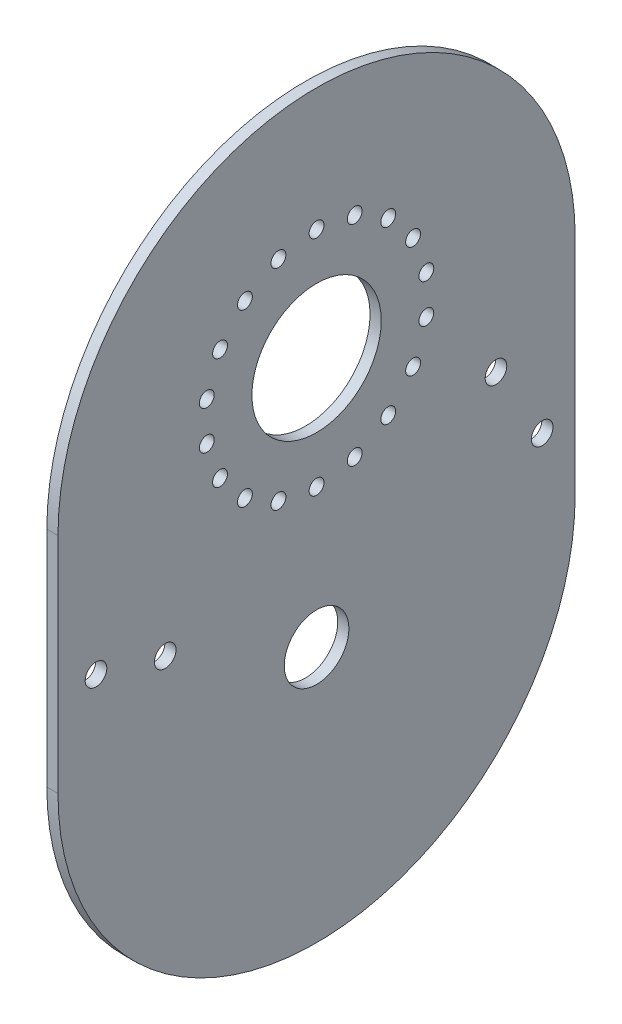
ISO-10303-21;
HEADER;
FILE_DESCRIPTION(('STEP AP214'),'2;1');
FILE_NAME('part.step','',(''),(''),'','','');
FILE_SCHEMA(('AUTOMOTIVE_DESIGN { 1 0 10303 214 1 1 1 1 }'));
ENDSEC;
DATA;
#1=APPLICATION_CONTEXT('core data for automotive mechanical design processes');
#2=APPLICATION_PROTOCOL_DEFINITION('international standard','automotive_design',2000,#1);
#3=PRODUCT_CONTEXT('',#1,'mechanical');
#4=PRODUCT('Part','Part','',(#3));
#5=PRODUCT_RELATED_PRODUCT_CATEGORY('part','',(#4));
#6=PRODUCT_DEFINITION_FORMATION('','',#4);
#7=PRODUCT_DEFINITION_CONTEXT('part definition',#1,'design');
#8=PRODUCT_DEFINITION('design','',#6,#7);
#9=PRODUCT_DEFINITION_SHAPE('','',#8);
#10=(LENGTH_UNIT() NAMED_UNIT(*) SI_UNIT(.MILLI.,.METRE.));
#11=(NAMED_UNIT(*) PLANE_ANGLE_UNIT() SI_UNIT($,.RADIAN.));
#12=(NAMED_UNIT(*) SI_UNIT($,.STERADIAN.) SOLID_ANGLE_UNIT());
#13=UNCERTAINTY_MEASURE_WITH_UNIT(LENGTH_MEASURE(1.E-05),#10,'distance_accuracy_value','');
#14=(GEOMETRIC_REPRESENTATION_CONTEXT(3) GLOBAL_UNCERTAINTY_ASSIGNED_CONTEXT((#13)) GLOBAL_UNIT_ASSIGNED_CONTEXT((#10,
#11,#12)) REPRESENTATION_CONTEXT('',''));
#15=CARTESIAN_POINT('',(0.,0.,0.));
#16=DIRECTION('',(0.,0.,1.));
#17=DIRECTION('',(1.,0.,0.));
#18=AXIS2_PLACEMENT_3D('',#15,#16,#17);
#19=CARTESIAN_POINT('',(6.25,1.0079783854671,173.991145722186));
#20=DIRECTION('',(0.,0.,-1.));
#21=DIRECTION('',(-1.,0.,0.));
#22=AXIS2_PLACEMENT_3D('',#19,#20,#21);
#23=PLANE('',#22);
#24=DIRECTION('',(0.,-1.,0.));
#25=VECTOR('',#24,1.);
#26=CARTESIAN_POINT('',(-1.25,1.0079783854671,173.991145722186));
#27=LINE('',#26,#25);
#28=CARTESIAN_POINT('',(-1.25,76.1579783854671,173.991145722186));
#29=VERTEX_POINT('',#28);
#30=CARTESIAN_POINT('',(-1.25,-74.1420216145329,173.991145722186));
#31=VERTEX_POINT('',#30);
#32=EDGE_CURVE('E121',#29,#31,#27,.T.);
#33=ORIENTED_EDGE('',*,*,#32,.T.);
#34=DIRECTION('',(-1.,0.,0.));
#35=VECTOR('',#34,1.);
#36=CARTESIAN_POINT('',(6.25,-74.1420216145329,173.991145722186));
#37=LINE('',#36,#35);
#38=CARTESIAN_POINT('',(6.25,-74.1420216145329,173.991145722186));
#39=VERTEX_POINT('',#38);
#40=EDGE_CURVE('E11',#39,#31,#37,.T.);
#41=ORIENTED_EDGE('',*,*,#40,.F.);
#42=DIRECTION('',(0.,-1.,0.));
#43=VECTOR('',#42,1.);
#44=CARTESIAN_POINT('',(6.25,1.0079783854671,173.991145722186));
#45=LINE('',#44,#43);
#46=CARTESIAN_POINT('',(6.25,76.1579783854671,173.991145722186));
#47=VERTEX_POINT('',#46);
#48=EDGE_CURVE('E87',#47,#39,#45,.T.);
#49=ORIENTED_EDGE('',*,*,#48,.F.);
#50=DIRECTION('',(-1.,0.,0.));
#51=VECTOR('',#50,1.);
#52=CARTESIAN_POINT('',(6.25,76.1579783854671,173.991145722186));
#53=LINE('',#52,#51);
#54=EDGE_CURVE('E99',#47,#29,#53,.T.);
#55=ORIENTED_EDGE('',*,*,#54,.T.);
#56=EDGE_LOOP('',(#33,#41,#49,#55));
#57=FACE_BOUND('',#56,.T.);
#58=ADVANCED_FACE('F37',(#57),#23,.F.);
#59=CARTESIAN_POINT('',(6.25,-74.1420216145329,-0.00885427781406736));
#60=DIRECTION('',(-1.,0.,0.));
#61=DIRECTION('',(0.,0.,1.));
#62=AXIS2_PLACEMENT_3D('',#59,#60,#61);
#63=CYLINDRICAL_SURFACE('',#62,174.);
#64=CARTESIAN_POINT('',(-1.25,-74.1420216145329,-0.00885427781406736));
#65=DIRECTION('',(1.,0.,0.));
#66=DIRECTION('',(0.,0.,-1.));
#67=AXIS2_PLACEMENT_3D('',#64,#65,#66);
#68=CIRCLE('',#67,174.);
#69=CARTESIAN_POINT('',(-1.25,-74.1420216145329,-174.008854277814));
#70=VERTEX_POINT('',#69);
#71=EDGE_CURVE('E92',#31,#70,#68,.T.);
#72=ORIENTED_EDGE('',*,*,#71,.T.);
#73=DIRECTION('',(-1.,0.,0.));
#74=VECTOR('',#73,1.);
#75=CARTESIAN_POINT('',(6.25,-74.1420216145329,-174.008854277814));
#76=LINE('',#75,#74);
#77=CARTESIAN_POINT('',(6.25,-74.1420216145329,-174.008854277814));
#78=VERTEX_POINT('',#77);
#79=EDGE_CURVE('E47',#78,#70,#76,.T.);
#80=ORIENTED_EDGE('',*,*,#79,.F.);
#81=CARTESIAN_POINT('',(6.25,-74.1420216145329,-0.00885427781406736));
#82=DIRECTION('',(1.,0.,0.));
#83=DIRECTION('',(0.,0.,-1.));
#84=AXIS2_PLACEMENT_3D('',#81,#82,#83);
#85=CIRCLE('',#84,174.);
#86=EDGE_CURVE('E82',#39,#78,#85,.T.);
#87=ORIENTED_EDGE('',*,*,#86,.F.);
#88=ORIENTED_EDGE('',*,*,#40,.T.);
#89=EDGE_LOOP('',(#72,#80,#87,#88));
#90=FACE_BOUND('',#89,.T.);
#91=ADVANCED_FACE('F91',(#90),#63,.T.);
#92=CARTESIAN_POINT('',(6.25,1.0079783854671,-174.008854277814));
#93=DIRECTION('',(0.,0.,-1.));
#94=DIRECTION('',(-1.,0.,0.));
#95=AXIS2_PLACEMENT_3D('',#92,#93,#94);
#96=PLANE('',#95);
#97=DIRECTION('',(0.,-1.,0.));
#98=VECTOR('',#97,1.);
#99=CARTESIAN_POINT('',(-1.25,1.0079783854671,-174.008854277814));
#100=LINE('',#99,#98);
#101=CARTESIAN_POINT('',(-1.25,76.1579783854671,-174.008854277814));
#102=VERTEX_POINT('',#101);
#103=EDGE_CURVE('E125',#102,#70,#100,.T.);
#104=ORIENTED_EDGE('',*,*,#103,.F.);
#105=DIRECTION('',(-1.,0.,0.));
#106=VECTOR('',#105,1.);
#107=CARTESIAN_POINT('',(6.25,76.1579783854671,-174.008854277814));
#108=LINE('',#107,#106);
#109=CARTESIAN_POINT('',(6.25,76.1579783854671,-174.008854277814));
#110=VERTEX_POINT('',#109);
#111=EDGE_CURVE('E72',#110,#102,#108,.T.);
#112=ORIENTED_EDGE('',*,*,#111,.F.);
#113=DIRECTION('',(0.,-1.,0.));
#114=VECTOR('',#113,1.);
#115=CARTESIAN_POINT('',(6.25,1.0079783854671,-174.008854277814));
#116=LINE('',#115,#114);
#117=EDGE_CURVE('E85',#110,#78,#116,.T.);
#118=ORIENTED_EDGE('',*,*,#117,.T.);
#119=ORIENTED_EDGE('',*,*,#79,.T.);
#120=EDGE_LOOP('',(#104,#112,#118,#119));
#121=FACE_BOUND('',#120,.T.);
#122=ADVANCED_FACE('F97',(#121),#96,.T.);
#123=CARTESIAN_POINT('',(6.25,24.0792662569805,-120.71795018761));
#124=DIRECTION('',(-1.,0.,0.));
#125=DIRECTION('',(0.,0.,1.));
#126=AXIS2_PLACEMENT_3D('',#123,#124,#125);
#127=CYLINDRICAL_SURFACE('',#126,7.275);
#128=CARTESIAN_POINT('',(6.25,24.0792662569805,-120.71795018761));
#129=DIRECTION('',(1.,0.,0.));
#130=DIRECTION('',(0.,0.,-1.));
#131=AXIS2_PLACEMENT_3D('',#128,#129,#130);
#132=CIRCLE('',#131,7.275);
#133=CARTESIAN_POINT('',(6.25,24.0792662569805,-127.99295018761));
#134=VERTEX_POINT('',#133);
#135=EDGE_CURVE('E589',#134,#134,#132,.T.);
#136=ORIENTED_EDGE('',*,*,#135,.T.);
#137=EDGE_LOOP('',(#136));
#138=FACE_BOUND('',#137,.T.);
#139=CARTESIAN_POINT('',(-1.25,24.0792662569805,-120.71795018761));
#140=DIRECTION('',(1.,0.,0.));
#141=DIRECTION('',(0.,0.,-1.));
#142=AXIS2_PLACEMENT_3D('',#139,#140,#141);
#143=CIRCLE('',#142,7.275);
#144=CARTESIAN_POINT('',(-1.25,24.0792662569805,-127.99295018761));
#145=VERTEX_POINT('',#144);
#146=EDGE_CURVE('E118',#145,#145,#143,.T.);
#147=ORIENTED_EDGE('',*,*,#146,.F.);
#148=EDGE_LOOP('',(#147));
#149=FACE_BOUND('',#148,.T.);
#150=ADVANCED_FACE('F210',(#138,#149),#127,.F.);
#151=CARTESIAN_POINT('',(6.25,92.623747324861,-0.00885427781402573));
#152=DIRECTION('',(-1.,0.,0.));
#153=DIRECTION('',(0.,0.,1.));
#154=AXIS2_PLACEMENT_3D('',#151,#152,#153);
#155=CYLINDRICAL_SURFACE('',#154,43.5);
#156=CARTESIAN_POINT('',(6.25,92.623747324861,-0.00885427781402573));
#157=DIRECTION('',(1.,0.,0.));
#158=DIRECTION('',(0.,0.,-1.));
#159=AXIS2_PLACEMENT_3D('',#156,#157,#158);
#160=CIRCLE('',#159,43.5);
#161=CARTESIAN_POINT('',(6.25,92.623747324861,-43.508854277814));
#162=VERTEX_POINT('',#161);
#163=EDGE_CURVE('E586',#162,#162,#160,.T.);
#164=ORIENTED_EDGE('',*,*,#163,.T.);
#165=EDGE_LOOP('',(#164));
#166=FACE_BOUND('',#165,.T.);
#167=CARTESIAN_POINT('',(-1.25,92.623747324861,-0.00885427781402573));
#168=DIRECTION('',(1.,0.,0.));
#169=DIRECTION('',(0.,0.,-1.));
#170=AXIS2_PLACEMENT_3D('',#167,#168,#169);
#171=CIRCLE('',#170,43.5);
#172=CARTESIAN_POINT('',(-1.25,92.623747324861,-43.508854277814));
#173=VERTEX_POINT('',#172);
#174=EDGE_CURVE('E115',#173,#173,#171,.T.);
#175=ORIENTED_EDGE('',*,*,#174,.F.);
#176=EDGE_LOOP('',(#175));
#177=FACE_BOUND('',#176,.T.);
#178=ADVANCED_FACE('F213',(#166,#177),#155,.F.);
#179=CARTESIAN_POINT('',(6.25,-27.0653924318316,-151.824539137335));
#180=DIRECTION('',(-1.,0.,0.));
#181=DIRECTION('',(0.,0.,1.));
#182=AXIS2_PLACEMENT_3D('',#179,#180,#181);
#183=CYLINDRICAL_SURFACE('',#182,7.275);
#184=CARTESIAN_POINT('',(6.25,-27.0653924318316,-151.824539137335));
#185=DIRECTION('',(1.,0.,0.));
#186=DIRECTION('',(0.,0.,-1.));
#187=AXIS2_PLACEMENT_3D('',#184,#185,#186);
#188=CIRCLE('',#187,7.275);
#189=CARTESIAN_POINT('',(6.25,-27.0653924318316,-159.099539137335));
#190=VERTEX_POINT('',#189);
#191=EDGE_CURVE('E583',#190,#190,#188,.T.);
#192=ORIENTED_EDGE('',*,*,#191,.T.);
#193=EDGE_LOOP('',(#192));
#194=FACE_BOUND('',#193,.T.);
#195=CARTESIAN_POINT('',(-1.25,-27.0653924318316,-151.824539137335));
#196=DIRECTION('',(1.,0.,0.));
#197=DIRECTION('',(0.,0.,-1.));
#198=AXIS2_PLACEMENT_3D('',#195,#196,#197);
#199=CIRCLE('',#198,7.275);
#200=CARTESIAN_POINT('',(-1.25,-27.0653924318316,-159.099539137335));
#201=VERTEX_POINT('',#200);
#202=EDGE_CURVE('E112',#201,#201,#199,.T.);
#203=ORIENTED_EDGE('',*,*,#202,.F.);
#204=EDGE_LOOP('',(#203));
#205=FACE_BOUND('',#204,.T.);
#206=ADVANCED_FACE('F217',(#194,#205),#183,.F.);
#207=CARTESIAN_POINT('',(6.25,-30.078286302028,101.839356172288));
#208=DIRECTION('',(-1.,0.,0.));
#209=DIRECTION('',(0.,0.,1.));
#210=AXIS2_PLACEMENT_3D('',#207,#208,#209);
#211=CYLINDRICAL_SURFACE('',#210,7.27500000000002);
#212=CARTESIAN_POINT('',(6.25,-30.078286302028,101.839356172288));
#213=DIRECTION('',(1.,0.,0.));
#214=DIRECTION('',(0.,0.,-1.));
#215=AXIS2_PLACEMENT_3D('',#212,#213,#214);
#216=CIRCLE('',#215,7.27500000000002);
#217=CARTESIAN_POINT('',(6.25,-30.078286302028,94.5643561722882));
#218=VERTEX_POINT('',#217);
#219=EDGE_CURVE('E580',#218,#218,#216,.T.);
#220=ORIENTED_EDGE('',*,*,#219,.T.);
#221=EDGE_LOOP('',(#220));
#222=FACE_BOUND('',#221,.T.);
#223=CARTESIAN_POINT('',(-1.25,-30.078286302028,101.839356172288));
#224=DIRECTION('',(1.,0.,0.));
#225=DIRECTION('',(0.,0.,-1.));
#226=AXIS2_PLACEMENT_3D('',#223,#224,#225);
#227=CIRCLE('',#226,7.27500000000002);
#228=CARTESIAN_POINT('',(-1.25,-30.078286302028,94.5643561722882));
#229=VERTEX_POINT('',#228);
#230=EDGE_CURVE('E109',#229,#229,#227,.T.);
#231=ORIENTED_EDGE('',*,*,#230,.F.);
#232=EDGE_LOOP('',(#231));
#233=FACE_BOUND('',#232,.T.);
#234=ADVANCED_FACE('F221',(#222,#233),#211,.F.);
#235=CARTESIAN_POINT('',(6.25,-17.5432763832161,148.409909143197));
#236=DIRECTION('',(-1.,0.,0.));
#237=DIRECTION('',(0.,0.,1.));
#238=AXIS2_PLACEMENT_3D('',#235,#236,#237);
#239=CYLINDRICAL_SURFACE('',#238,7.27500000000002);
#240=CARTESIAN_POINT('',(6.25,-17.5432763832161,148.409909143197));
#241=DIRECTION('',(1.,0.,0.));
#242=DIRECTION('',(0.,0.,-1.));
#243=AXIS2_PLACEMENT_3D('',#240,#241,#242);
#244=CIRCLE('',#243,7.27500000000002);
#245=CARTESIAN_POINT('',(6.25,-17.5432763832161,141.134909143197));
#246=VERTEX_POINT('',#245);
#247=EDGE_CURVE('E236',#246,#246,#244,.T.);
#248=ORIENTED_EDGE('',*,*,#247,.T.);
#249=EDGE_LOOP('',(#248));
#250=FACE_BOUND('',#249,.T.);
#251=CARTESIAN_POINT('',(-1.25,-17.5432763832161,148.409909143197));
#252=DIRECTION('',(1.,0.,0.));
#253=DIRECTION('',(0.,0.,-1.));
#254=AXIS2_PLACEMENT_3D('',#251,#252,#253);
#255=CIRCLE('',#254,7.27500000000002);
#256=CARTESIAN_POINT('',(-1.25,-17.5432763832161,141.134909143197));
#257=VERTEX_POINT('',#256);
#258=EDGE_CURVE('E106',#257,#257,#255,.T.);
#259=ORIENTED_EDGE('',*,*,#258,.F.);
#260=EDGE_LOOP('',(#259));
#261=FACE_BOUND('',#260,.T.);
#262=ADVANCED_FACE('F224',(#250,#261),#239,.F.);
#263=CARTESIAN_POINT('',(6.25,-75.858502675139,-0.00885427781402573));
#264=DIRECTION('',(-1.,0.,0.));
#265=DIRECTION('',(0.,0.,1.));
#266=AXIS2_PLACEMENT_3D('',#263,#264,#265);
#267=CYLINDRICAL_SURFACE('',#266,21.75);
#268=CARTESIAN_POINT('',(6.25,-75.858502675139,-0.00885427781402573));
#269=DIRECTION('',(1.,0.,0.));
#270=DIRECTION('',(0.,0.,-1.));
#271=AXIS2_PLACEMENT_3D('',#268,#269,#270);
#272=CIRCLE('',#271,21.75);
#273=CARTESIAN_POINT('',(6.25,-75.858502675139,-21.758854277814));
#274=VERTEX_POINT('',#273);
#275=EDGE_CURVE('E128',#274,#274,#272,.T.);
#276=ORIENTED_EDGE('',*,*,#275,.T.);
#277=EDGE_LOOP('',(#276));
#278=FACE_BOUND('',#277,.T.);
#279=CARTESIAN_POINT('',(-1.25,-75.858502675139,-0.00885427781402573));
#280=DIRECTION('',(1.,0.,0.));
#281=DIRECTION('',(0.,0.,-1.));
#282=AXIS2_PLACEMENT_3D('',#279,#280,#281);
#283=CIRCLE('',#282,21.75);
#284=CARTESIAN_POINT('',(-1.25,-75.858502675139,-21.758854277814));
#285=VERTEX_POINT('',#284);
#286=EDGE_CURVE('E103',#285,#285,#283,.T.);
#287=ORIENTED_EDGE('',*,*,#286,.F.);
#288=EDGE_LOOP('',(#287));
#289=FACE_BOUND('',#288,.T.);
#290=ADVANCED_FACE('F39',(#278,#289),#267,.F.);
#291=CARTESIAN_POINT('',(6.25,76.1579783854671,-0.00885427781408818));
#292=DIRECTION('',(-1.,0.,0.));
#293=DIRECTION('',(0.,0.,1.));
#294=AXIS2_PLACEMENT_3D('',#291,#292,#293);
#295=CYLINDRICAL_SURFACE('',#294,174.);
#296=CARTESIAN_POINT('',(-1.25,76.1579783854671,-0.00885427781408818));
#297=DIRECTION('',(1.,0.,0.));
#298=DIRECTION('',(0.,0.,-1.));
#299=AXIS2_PLACEMENT_3D('',#296,#297,#298);
#300=CIRCLE('',#299,174.);
#301=EDGE_CURVE('E75',#102,#29,#300,.T.);
#302=ORIENTED_EDGE('',*,*,#301,.T.);
#303=ORIENTED_EDGE('',*,*,#54,.F.);
#304=CARTESIAN_POINT('',(6.25,76.1579783854671,-0.00885427781408818));
#305=DIRECTION('',(1.,0.,0.));
#306=DIRECTION('',(0.,0.,-1.));
#307=AXIS2_PLACEMENT_3D('',#304,#305,#306);
#308=CIRCLE('',#307,174.);
#309=EDGE_CURVE('E56',#110,#47,#308,.T.);
#310=ORIENTED_EDGE('',*,*,#309,.F.);
#311=ORIENTED_EDGE('',*,*,#111,.T.);
#312=EDGE_LOOP('',(#302,#303,#310,#311));
#313=FACE_BOUND('',#312,.T.);
#314=ADVANCED_FACE('F231',(#313),#295,.T.);
#315=CARTESIAN_POINT('',(6.25,1.0079783854671,-0.00885427781402573));
#316=DIRECTION('',(1.,0.,0.));
#317=DIRECTION('',(0.,0.,-1.));
#318=AXIS2_PLACEMENT_3D('',#315,#316,#317);
#319=PLANE('',#318);
#320=CARTESIAN_POINT('',(6.25,163.100693883806,-25.6603650272395));
#321=DIRECTION('',(1.,0.,0.));
#322=DIRECTION('',(0.,0.,-1.));
#323=AXIS2_PLACEMENT_3D('',#320,#321,#322);
#324=CIRCLE('',#323,5.);
#325=CARTESIAN_POINT('',(6.25,163.100693883806,-30.6603650272395));
#326=VERTEX_POINT('',#325);
#327=EDGE_CURVE('E532',#326,#326,#324,.T.);
#328=ORIENTED_EDGE('',*,*,#327,.F.);
#329=EDGE_LOOP('',(#328));
#330=FACE_BOUND('',#329,.T.);
#331=CARTESIAN_POINT('',(6.25,150.077080558787,-48.2179250043056));
#332=DIRECTION('',(1.,0.,0.));
#333=DIRECTION('',(0.,0.,-1.));
#334=AXIS2_PLACEMENT_3D('',#331,#332,#333);
#335=CIRCLE('',#334,5.00000000000001);
#336=CARTESIAN_POINT('',(6.25,150.077080558787,-53.2179250043056));
#337=VERTEX_POINT('',#336);
#338=EDGE_CURVE('E528',#337,#337,#335,.T.);
#339=ORIENTED_EDGE('',*,*,#338,.F.);
#340=EDGE_LOOP('',(#339));
#341=FACE_BOUND('',#340,.T.);
#342=CARTESIAN_POINT('',(6.25,130.123747324865,-64.9607595616492));
#343=DIRECTION('',(1.,0.,0.));
#344=DIRECTION('',(0.,0.,-1.));
#345=AXIS2_PLACEMENT_3D('',#342,#343,#344);
#346=CIRCLE('',#345,4.99999999999997);
#347=CARTESIAN_POINT('',(6.25,130.123747324865,-69.9607595616491));
#348=VERTEX_POINT('',#347);
#349=EDGE_CURVE('E476',#348,#348,#346,.T.);
#350=ORIENTED_EDGE('',*,*,#349,.F.);
#351=EDGE_LOOP('',(#350));
#352=FACE_BOUND('',#351,.T.);
#353=CARTESIAN_POINT('',(6.25,105.647360649885,-73.8694357537332));
#354=DIRECTION('',(1.,0.,0.));
#355=DIRECTION('',(0.,0.,-1.));
#356=AXIS2_PLACEMENT_3D('',#353,#354,#355);
#357=CIRCLE('',#356,5.00000000000001);
#358=CARTESIAN_POINT('',(6.25,105.647360649885,-78.8694357537332));
#359=VERTEX_POINT('',#358);
#360=EDGE_CURVE('E529',#359,#359,#357,.T.);
#361=ORIENTED_EDGE('',*,*,#360,.F.);
#362=EDGE_LOOP('',(#361));
#363=FACE_BOUND('',#362,.T.);
#364=CARTESIAN_POINT('',(6.25,79.6001339998452,-73.8694357537346));
#365=DIRECTION('',(1.,0.,0.));
#366=DIRECTION('',(0.,0.,-1.));
#367=AXIS2_PLACEMENT_3D('',#364,#365,#366);
#368=CIRCLE('',#367,5.00000000000001);
#369=CARTESIAN_POINT('',(6.25,79.6001339998452,-78.8694357537346));
#370=VERTEX_POINT('',#369);
#371=EDGE_CURVE('E535',#370,#370,#368,.T.);
#372=ORIENTED_EDGE('',*,*,#371,.F.);
#373=EDGE_LOOP('',(#372));
#374=FACE_BOUND('',#373,.T.);
#375=CARTESIAN_POINT('',(6.25,55.1237473248644,-64.9607595616531));
#376=DIRECTION('',(1.,0.,0.));
#377=DIRECTION('',(0.,0.,-1.));
#378=AXIS2_PLACEMENT_3D('',#375,#376,#377);
#379=CIRCLE('',#378,5.);
#380=CARTESIAN_POINT('',(6.25,55.1237473248644,-69.9607595616531));
#381=VERTEX_POINT('',#380);
#382=EDGE_CURVE('E541',#381,#381,#379,.T.);
#383=ORIENTED_EDGE('',*,*,#382,.F.);
#384=EDGE_LOOP('',(#383));
#385=FACE_BOUND('',#384,.T.);
#386=CARTESIAN_POINT('',(6.25,35.1704140909401,-48.2179250043117));
#387=DIRECTION('',(1.,0.,0.));
#388=DIRECTION('',(0.,0.,-1.));
#389=AXIS2_PLACEMENT_3D('',#386,#387,#388);
#390=CIRCLE('',#389,4.99999999999998);
#391=CARTESIAN_POINT('',(6.25,35.1704140909401,-53.2179250043117));
#392=VERTEX_POINT('',#391);
#393=EDGE_CURVE('E544',#392,#392,#390,.T.);
#394=ORIENTED_EDGE('',*,*,#393,.F.);
#395=EDGE_LOOP('',(#394));
#396=FACE_BOUND('',#395,.T.);
#397=CARTESIAN_POINT('',(6.25,22.1468007659191,-25.660365027247));
#398=DIRECTION('',(1.,0.,0.));
#399=DIRECTION('',(0.,0.,-1.));
#400=AXIS2_PLACEMENT_3D('',#397,#398,#399);
#401=CIRCLE('',#400,4.99999999999999);
#402=CARTESIAN_POINT('',(6.25,22.1468007659191,-30.660365027247));
#403=VERTEX_POINT('',#402);
#404=EDGE_CURVE('E547',#403,#403,#401,.T.);
#405=ORIENTED_EDGE('',*,*,#404,.F.);
#406=EDGE_LOOP('',(#405));
#407=FACE_BOUND('',#406,.T.);
#408=CARTESIAN_POINT('',(6.25,17.623747324861,-0.00885427782200096));
#409=DIRECTION('',(1.,0.,0.));
#410=DIRECTION('',(0.,0.,-1.));
#411=AXIS2_PLACEMENT_3D('',#408,#409,#410);
#412=CIRCLE('',#411,5.);
#413=CARTESIAN_POINT('',(6.25,17.623747324861,-5.008854277822));
#414=VERTEX_POINT('',#413);
#415=EDGE_CURVE('E550',#414,#414,#412,.T.);
#416=ORIENTED_EDGE('',*,*,#415,.F.);
#417=EDGE_LOOP('',(#416));
#418=FACE_BOUND('',#417,.T.);
#419=CARTESIAN_POINT('',(6.25,22.1468007659166,25.6426564716034));
#420=DIRECTION('',(1.,0.,0.));
#421=DIRECTION('',(0.,0.,-1.));
#422=AXIS2_PLACEMENT_3D('',#419,#420,#421);
#423=CIRCLE('',#422,4.99999999999999);
#424=CARTESIAN_POINT('',(6.25,22.1468007659166,20.6426564716034));
#425=VERTEX_POINT('',#424);
#426=EDGE_CURVE('E553',#425,#425,#423,.T.);
#427=ORIENTED_EDGE('',*,*,#426,.F.);
#428=EDGE_LOOP('',(#427));
#429=FACE_BOUND('',#428,.T.);
#430=CARTESIAN_POINT('',(6.25,35.1704140909354,48.2002164486694));
#431=DIRECTION('',(1.,0.,0.));
#432=DIRECTION('',(0.,0.,-1.));
#433=AXIS2_PLACEMENT_3D('',#430,#431,#432);
#434=CIRCLE('',#433,5.);
#435=CARTESIAN_POINT('',(6.25,35.1704140909354,43.2002164486694));
#436=VERTEX_POINT('',#435);
#437=EDGE_CURVE('E556',#436,#436,#434,.T.);
#438=ORIENTED_EDGE('',*,*,#437,.F.);
#439=EDGE_LOOP('',(#438));
#440=FACE_BOUND('',#439,.T.);
#441=CARTESIAN_POINT('',(6.25,55.123747324858,64.9430510060129));
#442=DIRECTION('',(1.,0.,0.));
#443=DIRECTION('',(0.,0.,-1.));
#444=AXIS2_PLACEMENT_3D('',#441,#442,#443);
#445=CIRCLE('',#444,4.99999999999998);
#446=CARTESIAN_POINT('',(6.25,55.123747324858,59.9430510060129));
#447=VERTEX_POINT('',#446);
#448=EDGE_CURVE('E559',#447,#447,#445,.T.);
#449=ORIENTED_EDGE('',*,*,#448,.F.);
#450=EDGE_LOOP('',(#449));
#451=FACE_BOUND('',#450,.T.);
#452=CARTESIAN_POINT('',(6.25,79.6001339998378,73.8517271980968));
#453=DIRECTION('',(1.,0.,0.));
#454=DIRECTION('',(0.,0.,-1.));
#455=AXIS2_PLACEMENT_3D('',#452,#453,#454);
#456=CIRCLE('',#455,5.);
#457=CARTESIAN_POINT('',(6.25,79.6001339998378,68.8517271980968));
#458=VERTEX_POINT('',#457);
#459=EDGE_CURVE('E562',#458,#458,#456,.T.);
#460=ORIENTED_EDGE('',*,*,#459,.F.);
#461=EDGE_LOOP('',(#460));
#462=FACE_BOUND('',#461,.T.);
#463=CARTESIAN_POINT('',(6.25,105.647360649877,73.851727198098));
#464=DIRECTION('',(1.,0.,0.));
#465=DIRECTION('',(0.,0.,-1.));
#466=AXIS2_PLACEMENT_3D('',#463,#464,#465);
#467=CIRCLE('',#466,5.00000000000001);
#468=CARTESIAN_POINT('',(6.25,105.647360649877,68.851727198098));
#469=VERTEX_POINT('',#468);
#470=EDGE_CURVE('E565',#469,#469,#467,.T.);
#471=ORIENTED_EDGE('',*,*,#470,.F.);
#472=EDGE_LOOP('',(#471));
#473=FACE_BOUND('',#472,.T.);
#474=CARTESIAN_POINT('',(6.25,130.123747324858,64.9430510060163));
#475=DIRECTION('',(1.,0.,0.));
#476=DIRECTION('',(0.,0.,-1.));
#477=AXIS2_PLACEMENT_3D('',#474,#475,#476);
#478=CIRCLE('',#477,4.99999999999998);
#479=CARTESIAN_POINT('',(6.25,130.123747324858,59.9430510060164));
#480=VERTEX_POINT('',#479);
#481=EDGE_CURVE('E568',#480,#480,#478,.T.);
#482=ORIENTED_EDGE('',*,*,#481,.F.);
#483=EDGE_LOOP('',(#482));
#484=FACE_BOUND('',#483,.T.);
#485=CARTESIAN_POINT('',(6.25,150.077080558782,48.2002164486748));
#486=DIRECTION('',(1.,0.,0.));
#487=DIRECTION('',(0.,0.,-1.));
#488=AXIS2_PLACEMENT_3D('',#485,#486,#487);
#489=CIRCLE('',#488,4.99999999999999);
#490=CARTESIAN_POINT('',(6.25,150.077080558782,43.2002164486748));
#491=VERTEX_POINT('',#490);
#492=EDGE_CURVE('E571',#491,#491,#489,.T.);
#493=ORIENTED_EDGE('',*,*,#492,.F.);
#494=EDGE_LOOP('',(#493));
#495=FACE_BOUND('',#494,.T.);
#496=CARTESIAN_POINT('',(6.25,163.100693883803,25.64265647161));
#497=DIRECTION('',(1.,0.,0.));
#498=DIRECTION('',(0.,0.,-1.));
#499=AXIS2_PLACEMENT_3D('',#496,#497,#498);
#500=CIRCLE('',#499,4.99999999999999);
#501=CARTESIAN_POINT('',(6.25,163.100693883803,20.64265647161));
#502=VERTEX_POINT('',#501);
#503=EDGE_CURVE('E574',#502,#502,#500,.T.);
#504=ORIENTED_EDGE('',*,*,#503,.F.);
#505=EDGE_LOOP('',(#504));
#506=FACE_BOUND('',#505,.T.);
#507=CARTESIAN_POINT('',(6.25,167.623747324861,-0.00885427781402573));
#508=DIRECTION('',(1.,0.,0.));
#509=DIRECTION('',(0.,0.,-1.));
#510=AXIS2_PLACEMENT_3D('',#507,#508,#509);
#511=CIRCLE('',#510,5.);
#512=CARTESIAN_POINT('',(6.25,167.623747324861,-5.00885427781403));
#513=VERTEX_POINT('',#512);
#514=EDGE_CURVE('E135',#513,#513,#511,.T.);
#515=ORIENTED_EDGE('',*,*,#514,.F.);
#516=EDGE_LOOP('',(#515));
#517=FACE_BOUND('',#516,.T.);
#518=ORIENTED_EDGE('',*,*,#275,.F.);
#519=EDGE_LOOP('',(#518));
#520=FACE_BOUND('',#519,.T.);
#521=ORIENTED_EDGE('',*,*,#247,.F.);
#522=EDGE_LOOP('',(#521));
#523=FACE_BOUND('',#522,.T.);
#524=ORIENTED_EDGE('',*,*,#219,.F.);
#525=EDGE_LOOP('',(#524));
#526=FACE_BOUND('',#525,.T.);
#527=ORIENTED_EDGE('',*,*,#191,.F.);
#528=EDGE_LOOP('',(#527));
#529=FACE_BOUND('',#528,.T.);
#530=ORIENTED_EDGE('',*,*,#163,.F.);
#531=EDGE_LOOP('',(#530));
#532=FACE_BOUND('',#531,.T.);
#533=ORIENTED_EDGE('',*,*,#135,.F.);
#534=EDGE_LOOP('',(#533));
#535=FACE_BOUND('',#534,.T.);
#536=ORIENTED_EDGE('',*,*,#48,.T.);
#537=ORIENTED_EDGE('',*,*,#86,.T.);
#538=ORIENTED_EDGE('',*,*,#117,.F.);
#539=ORIENTED_EDGE('',*,*,#309,.T.);
#540=EDGE_LOOP('',(#536,#537,#538,#539));
#541=FACE_BOUND('',#540,.T.);
#542=ADVANCED_FACE('F83',(#330,#341,#352,#363,#374,#385,#396,#407,#418,#429,#440,#451,#462,#473,
#484,#495,#506,#517,#520,#523,#526,#529,#532,#535,#541),#319,.T.);
#543=CARTESIAN_POINT('',(-1.25,1.0079783854671,-0.00885427781402573));
#544=DIRECTION('',(1.,0.,0.));
#545=DIRECTION('',(0.,0.,-1.));
#546=AXIS2_PLACEMENT_3D('',#543,#544,#545);
#547=PLANE('',#546);
#548=CARTESIAN_POINT('',(-1.25,163.100693883806,-25.6603650272395));
#549=DIRECTION('',(1.,0.,0.));
#550=DIRECTION('',(0.,0.,-1.));
#551=AXIS2_PLACEMENT_3D('',#548,#549,#550);
#552=CIRCLE('',#551,5.);
#553=CARTESIAN_POINT('',(-1.25,163.100693883806,-30.6603650272395));
#554=VERTEX_POINT('',#553);
#555=EDGE_CURVE('E41',#554,#554,#552,.T.);
#556=ORIENTED_EDGE('',*,*,#555,.T.);
#557=EDGE_LOOP('',(#556));
#558=FACE_BOUND('',#557,.T.);
#559=CARTESIAN_POINT('',(-1.25,150.077080558787,-48.2179250043056));
#560=DIRECTION('',(1.,0.,0.));
#561=DIRECTION('',(0.,0.,-1.));
#562=AXIS2_PLACEMENT_3D('',#559,#560,#561);
#563=CIRCLE('',#562,5.00000000000001);
#564=CARTESIAN_POINT('',(-1.25,150.077080558787,-53.2179250043056));
#565=VERTEX_POINT('',#564);
#566=EDGE_CURVE('E179',#565,#565,#563,.T.);
#567=ORIENTED_EDGE('',*,*,#566,.T.);
#568=EDGE_LOOP('',(#567));
#569=FACE_BOUND('',#568,.T.);
#570=CARTESIAN_POINT('',(-1.25,130.123747324865,-64.9607595616492));
#571=DIRECTION('',(1.,0.,0.));
#572=DIRECTION('',(0.,0.,-1.));
#573=AXIS2_PLACEMENT_3D('',#570,#571,#572);
#574=CIRCLE('',#573,4.99999999999997);
#575=CARTESIAN_POINT('',(-1.25,130.123747324865,-69.9607595616491));
#576=VERTEX_POINT('',#575);
#577=EDGE_CURVE('E177',#576,#576,#574,.T.);
#578=ORIENTED_EDGE('',*,*,#577,.T.);
#579=EDGE_LOOP('',(#578));
#580=FACE_BOUND('',#579,.T.);
#581=CARTESIAN_POINT('',(-1.25,105.647360649885,-73.8694357537332));
#582=DIRECTION('',(1.,0.,0.));
#583=DIRECTION('',(0.,0.,-1.));
#584=AXIS2_PLACEMENT_3D('',#581,#582,#583);
#585=CIRCLE('',#584,5.00000000000001);
#586=CARTESIAN_POINT('',(-1.25,105.647360649885,-78.8694357537332));
#587=VERTEX_POINT('',#586);
#588=EDGE_CURVE('E174',#587,#587,#585,.T.);
#589=ORIENTED_EDGE('',*,*,#588,.T.);
#590=EDGE_LOOP('',(#589));
#591=FACE_BOUND('',#590,.T.);
#592=CARTESIAN_POINT('',(-1.25,79.6001339998452,-73.8694357537346));
#593=DIRECTION('',(1.,0.,0.));
#594=DIRECTION('',(0.,0.,-1.));
#595=AXIS2_PLACEMENT_3D('',#592,#593,#594);
#596=CIRCLE('',#595,5.00000000000001);
#597=CARTESIAN_POINT('',(-1.25,79.6001339998452,-78.8694357537346));
#598=VERTEX_POINT('',#597);
#599=EDGE_CURVE('E171',#598,#598,#596,.T.);
#600=ORIENTED_EDGE('',*,*,#599,.T.);
#601=EDGE_LOOP('',(#600));
#602=FACE_BOUND('',#601,.T.);
#603=CARTESIAN_POINT('',(-1.25,55.1237473248644,-64.9607595616531));
#604=DIRECTION('',(1.,0.,0.));
#605=DIRECTION('',(0.,0.,-1.));
#606=AXIS2_PLACEMENT_3D('',#603,#604,#605);
#607=CIRCLE('',#606,5.);
#608=CARTESIAN_POINT('',(-1.25,55.1237473248644,-69.9607595616531));
#609=VERTEX_POINT('',#608);
#610=EDGE_CURVE('E168',#609,#609,#607,.T.);
#611=ORIENTED_EDGE('',*,*,#610,.T.);
#612=EDGE_LOOP('',(#611));
#613=FACE_BOUND('',#612,.T.);
#614=CARTESIAN_POINT('',(-1.25,35.1704140909401,-48.2179250043117));
#615=DIRECTION('',(1.,0.,0.));
#616=DIRECTION('',(0.,0.,-1.));
#617=AXIS2_PLACEMENT_3D('',#614,#615,#616);
#618=CIRCLE('',#617,4.99999999999998);
#619=CARTESIAN_POINT('',(-1.25,35.1704140909401,-53.2179250043117));
#620=VERTEX_POINT('',#619);
#621=EDGE_CURVE('E165',#620,#620,#618,.T.);
#622=ORIENTED_EDGE('',*,*,#621,.T.);
#623=EDGE_LOOP('',(#622));
#624=FACE_BOUND('',#623,.T.);
#625=CARTESIAN_POINT('',(-1.25,22.1468007659191,-25.660365027247));
#626=DIRECTION('',(1.,0.,0.));
#627=DIRECTION('',(0.,0.,-1.));
#628=AXIS2_PLACEMENT_3D('',#625,#626,#627);
#629=CIRCLE('',#628,4.99999999999999);
#630=CARTESIAN_POINT('',(-1.25,22.1468007659191,-30.660365027247));
#631=VERTEX_POINT('',#630);
#632=EDGE_CURVE('E162',#631,#631,#629,.T.);
#633=ORIENTED_EDGE('',*,*,#632,.T.);
#634=EDGE_LOOP('',(#633));
#635=FACE_BOUND('',#634,.T.);
#636=CARTESIAN_POINT('',(-1.25,17.623747324861,-0.00885427782200096));
#637=DIRECTION('',(1.,0.,0.));
#638=DIRECTION('',(0.,0.,-1.));
#639=AXIS2_PLACEMENT_3D('',#636,#637,#638);
#640=CIRCLE('',#639,5.);
#641=CARTESIAN_POINT('',(-1.25,17.623747324861,-5.008854277822));
#642=VERTEX_POINT('',#641);
#643=EDGE_CURVE('E159',#642,#642,#640,.T.);
#644=ORIENTED_EDGE('',*,*,#643,.T.);
#645=EDGE_LOOP('',(#644));
#646=FACE_BOUND('',#645,.T.);
#647=CARTESIAN_POINT('',(-1.25,22.1468007659166,25.6426564716034));
#648=DIRECTION('',(1.,0.,0.));
#649=DIRECTION('',(0.,0.,-1.));
#650=AXIS2_PLACEMENT_3D('',#647,#648,#649);
#651=CIRCLE('',#650,4.99999999999999);
#652=CARTESIAN_POINT('',(-1.25,22.1468007659166,20.6426564716034));
#653=VERTEX_POINT('',#652);
#654=EDGE_CURVE('E156',#653,#653,#651,.T.);
#655=ORIENTED_EDGE('',*,*,#654,.T.);
#656=EDGE_LOOP('',(#655));
#657=FACE_BOUND('',#656,.T.);
#658=CARTESIAN_POINT('',(-1.25,35.1704140909354,48.2002164486694));
#659=DIRECTION('',(1.,0.,0.));
#660=DIRECTION('',(0.,0.,-1.));
#661=AXIS2_PLACEMENT_3D('',#658,#659,#660);
#662=CIRCLE('',#661,5.);
#663=CARTESIAN_POINT('',(-1.25,35.1704140909354,43.2002164486694));
#664=VERTEX_POINT('',#663);
#665=EDGE_CURVE('E153',#664,#664,#662,.T.);
#666=ORIENTED_EDGE('',*,*,#665,.T.);
#667=EDGE_LOOP('',(#666));
#668=FACE_BOUND('',#667,.T.);
#669=CARTESIAN_POINT('',(-1.25,55.123747324858,64.9430510060129));
#670=DIRECTION('',(1.,0.,0.));
#671=DIRECTION('',(0.,0.,-1.));
#672=AXIS2_PLACEMENT_3D('',#669,#670,#671);
#673=CIRCLE('',#672,4.99999999999998);
#674=CARTESIAN_POINT('',(-1.25,55.123747324858,59.9430510060129));
#675=VERTEX_POINT('',#674);
#676=EDGE_CURVE('E150',#675,#675,#673,.T.);
#677=ORIENTED_EDGE('',*,*,#676,.T.);
#678=EDGE_LOOP('',(#677));
#679=FACE_BOUND('',#678,.T.);
#680=CARTESIAN_POINT('',(-1.25,79.6001339998378,73.8517271980968));
#681=DIRECTION('',(1.,0.,0.));
#682=DIRECTION('',(0.,0.,-1.));
#683=AXIS2_PLACEMENT_3D('',#680,#681,#682);
#684=CIRCLE('',#683,5.);
#685=CARTESIAN_POINT('',(-1.25,79.6001339998378,68.8517271980968));
#686=VERTEX_POINT('',#685);
#687=EDGE_CURVE('E147',#686,#686,#684,.T.);
#688=ORIENTED_EDGE('',*,*,#687,.T.);
#689=EDGE_LOOP('',(#688));
#690=FACE_BOUND('',#689,.T.);
#691=CARTESIAN_POINT('',(-1.25,105.647360649877,73.851727198098));
#692=DIRECTION('',(1.,0.,0.));
#693=DIRECTION('',(0.,0.,-1.));
#694=AXIS2_PLACEMENT_3D('',#691,#692,#693);
#695=CIRCLE('',#694,5.00000000000001);
#696=CARTESIAN_POINT('',(-1.25,105.647360649877,68.851727198098));
#697=VERTEX_POINT('',#696);
#698=EDGE_CURVE('E144',#697,#697,#695,.T.);
#699=ORIENTED_EDGE('',*,*,#698,.T.);
#700=EDGE_LOOP('',(#699));
#701=FACE_BOUND('',#700,.T.);
#702=CARTESIAN_POINT('',(-1.25,130.123747324858,64.9430510060163));
#703=DIRECTION('',(1.,0.,0.));
#704=DIRECTION('',(0.,0.,-1.));
#705=AXIS2_PLACEMENT_3D('',#702,#703,#704);
#706=CIRCLE('',#705,4.99999999999998);
#707=CARTESIAN_POINT('',(-1.25,130.123747324858,59.9430510060164));
#708=VERTEX_POINT('',#707);
#709=EDGE_CURVE('E141',#708,#708,#706,.T.);
#710=ORIENTED_EDGE('',*,*,#709,.T.);
#711=EDGE_LOOP('',(#710));
#712=FACE_BOUND('',#711,.T.);
#713=CARTESIAN_POINT('',(-1.25,150.077080558782,48.2002164486748));
#714=DIRECTION('',(1.,0.,0.));
#715=DIRECTION('',(0.,0.,-1.));
#716=AXIS2_PLACEMENT_3D('',#713,#714,#715);
#717=CIRCLE('',#716,4.99999999999999);
#718=CARTESIAN_POINT('',(-1.25,150.077080558782,43.2002164486748));
#719=VERTEX_POINT('',#718);
#720=EDGE_CURVE('E138',#719,#719,#717,.T.);
#721=ORIENTED_EDGE('',*,*,#720,.T.);
#722=EDGE_LOOP('',(#721));
#723=FACE_BOUND('',#722,.T.);
#724=CARTESIAN_POINT('',(-1.25,163.100693883803,25.64265647161));
#725=DIRECTION('',(1.,0.,0.));
#726=DIRECTION('',(0.,0.,-1.));
#727=AXIS2_PLACEMENT_3D('',#724,#725,#726);
#728=CIRCLE('',#727,4.99999999999999);
#729=CARTESIAN_POINT('',(-1.25,163.100693883803,20.64265647161));
#730=VERTEX_POINT('',#729);
#731=EDGE_CURVE('E134',#730,#730,#728,.T.);
#732=ORIENTED_EDGE('',*,*,#731,.T.);
#733=EDGE_LOOP('',(#732));
#734=FACE_BOUND('',#733,.T.);
#735=CARTESIAN_POINT('',(-1.25,167.623747324861,-0.00885427781402573));
#736=DIRECTION('',(1.,0.,0.));
#737=DIRECTION('',(0.,0.,-1.));
#738=AXIS2_PLACEMENT_3D('',#735,#736,#737);
#739=CIRCLE('',#738,5.);
#740=CARTESIAN_POINT('',(-1.25,167.623747324861,-5.00885427781403));
#741=VERTEX_POINT('',#740);
#742=EDGE_CURVE('E131',#741,#741,#739,.T.);
#743=ORIENTED_EDGE('',*,*,#742,.T.);
#744=EDGE_LOOP('',(#743));
#745=FACE_BOUND('',#744,.T.);
#746=ORIENTED_EDGE('',*,*,#286,.T.);
#747=EDGE_LOOP('',(#746));
#748=FACE_BOUND('',#747,.T.);
#749=ORIENTED_EDGE('',*,*,#258,.T.);
#750=EDGE_LOOP('',(#749));
#751=FACE_BOUND('',#750,.T.);
#752=ORIENTED_EDGE('',*,*,#230,.T.);
#753=EDGE_LOOP('',(#752));
#754=FACE_BOUND('',#753,.T.);
#755=ORIENTED_EDGE('',*,*,#202,.T.);
#756=EDGE_LOOP('',(#755));
#757=FACE_BOUND('',#756,.T.);
#758=ORIENTED_EDGE('',*,*,#174,.T.);
#759=EDGE_LOOP('',(#758));
#760=FACE_BOUND('',#759,.T.);
#761=ORIENTED_EDGE('',*,*,#146,.T.);
#762=EDGE_LOOP('',(#761));
#763=FACE_BOUND('',#762,.T.);
#764=ORIENTED_EDGE('',*,*,#32,.F.);
#765=ORIENTED_EDGE('',*,*,#301,.F.);
#766=ORIENTED_EDGE('',*,*,#103,.T.);
#767=ORIENTED_EDGE('',*,*,#71,.F.);
#768=EDGE_LOOP('',(#764,#765,#766,#767));
#769=FACE_BOUND('',#768,.T.);
#770=ADVANCED_FACE('F186',(#558,#569,#580,#591,#602,#613,#624,#635,#646,#657,#668,#679,#690,
#701,#712,#723,#734,#745,#748,#751,#754,#757,#760,#763,#769),#547,.F.);
#771=CARTESIAN_POINT('',(-3.75,167.623747324861,-0.00885427781402573));
#772=DIRECTION('',(1.,0.,0.));
#773=DIRECTION('',(0.,0.,-1.));
#774=AXIS2_PLACEMENT_3D('',#771,#772,#773);
#775=CYLINDRICAL_SURFACE('',#774,5.);
#776=ORIENTED_EDGE('',*,*,#514,.T.);
#777=EDGE_LOOP('',(#776));
#778=FACE_BOUND('',#777,.T.);
#779=ORIENTED_EDGE('',*,*,#742,.F.);
#780=EDGE_LOOP('',(#779));
#781=FACE_BOUND('',#780,.T.);
#782=ADVANCED_FACE('F241',(#778,#781),#775,.F.);
#783=CARTESIAN_POINT('',(-3.75,163.100693883803,25.64265647161));
#784=DIRECTION('',(1.,0.,0.));
#785=DIRECTION('',(0.,0.,-1.));
#786=AXIS2_PLACEMENT_3D('',#783,#784,#785);
#787=CYLINDRICAL_SURFACE('',#786,4.99999999999999);
#788=ORIENTED_EDGE('',*,*,#503,.T.);
#789=EDGE_LOOP('',(#788));
#790=FACE_BOUND('',#789,.T.);
#791=ORIENTED_EDGE('',*,*,#731,.F.);
#792=EDGE_LOOP('',(#791));
#793=FACE_BOUND('',#792,.T.);
#794=ADVANCED_FACE('F311',(#790,#793),#787,.F.);
#795=CARTESIAN_POINT('',(-3.75,150.077080558782,48.2002164486748));
#796=DIRECTION('',(1.,0.,0.));
#797=DIRECTION('',(0.,0.,-1.));
#798=AXIS2_PLACEMENT_3D('',#795,#796,#797);
#799=CYLINDRICAL_SURFACE('',#798,4.99999999999999);
#800=ORIENTED_EDGE('',*,*,#492,.T.);
#801=EDGE_LOOP('',(#800));
#802=FACE_BOUND('',#801,.T.);
#803=ORIENTED_EDGE('',*,*,#720,.F.);
#804=EDGE_LOOP('',(#803));
#805=FACE_BOUND('',#804,.T.);
#806=ADVANCED_FACE('F321',(#802,#805),#799,.F.);
#807=CARTESIAN_POINT('',(-3.75,130.123747324858,64.9430510060163));
#808=DIRECTION('',(1.,0.,0.));
#809=DIRECTION('',(0.,0.,-1.));
#810=AXIS2_PLACEMENT_3D('',#807,#808,#809);
#811=CYLINDRICAL_SURFACE('',#810,4.99999999999998);
#812=ORIENTED_EDGE('',*,*,#481,.T.);
#813=EDGE_LOOP('',(#812));
#814=FACE_BOUND('',#813,.T.);
#815=ORIENTED_EDGE('',*,*,#709,.F.);
#816=EDGE_LOOP('',(#815));
#817=FACE_BOUND('',#816,.T.);
#818=ADVANCED_FACE('F330',(#814,#817),#811,.F.);
#819=CARTESIAN_POINT('',(-3.75,105.647360649877,73.851727198098));
#820=DIRECTION('',(1.,0.,0.));
#821=DIRECTION('',(0.,0.,-1.));
#822=AXIS2_PLACEMENT_3D('',#819,#820,#821);
#823=CYLINDRICAL_SURFACE('',#822,5.00000000000001);
#824=ORIENTED_EDGE('',*,*,#470,.T.);
#825=EDGE_LOOP('',(#824));
#826=FACE_BOUND('',#825,.T.);
#827=ORIENTED_EDGE('',*,*,#698,.F.);
#828=EDGE_LOOP('',(#827));
#829=FACE_BOUND('',#828,.T.);
#830=ADVANCED_FACE('F340',(#826,#829),#823,.F.);
#831=CARTESIAN_POINT('',(-3.75,79.6001339998378,73.8517271980968));
#832=DIRECTION('',(1.,0.,0.));
#833=DIRECTION('',(0.,0.,-1.));
#834=AXIS2_PLACEMENT_3D('',#831,#832,#833);
#835=CYLINDRICAL_SURFACE('',#834,5.);
#836=ORIENTED_EDGE('',*,*,#459,.T.);
#837=EDGE_LOOP('',(#836));
#838=FACE_BOUND('',#837,.T.);
#839=ORIENTED_EDGE('',*,*,#687,.F.);
#840=EDGE_LOOP('',(#839));
#841=FACE_BOUND('',#840,.T.);
#842=ADVANCED_FACE('F350',(#838,#841),#835,.F.);
#843=CARTESIAN_POINT('',(-3.75,55.123747324858,64.9430510060129));
#844=DIRECTION('',(1.,0.,0.));
#845=DIRECTION('',(0.,0.,-1.));
#846=AXIS2_PLACEMENT_3D('',#843,#844,#845);
#847=CYLINDRICAL_SURFACE('',#846,4.99999999999998);
#848=ORIENTED_EDGE('',*,*,#448,.T.);
#849=EDGE_LOOP('',(#848));
#850=FACE_BOUND('',#849,.T.);
#851=ORIENTED_EDGE('',*,*,#676,.F.);
#852=EDGE_LOOP('',(#851));
#853=FACE_BOUND('',#852,.T.);
#854=ADVANCED_FACE('F360',(#850,#853),#847,.F.);
#855=CARTESIAN_POINT('',(-3.75,35.1704140909354,48.2002164486694));
#856=DIRECTION('',(1.,0.,0.));
#857=DIRECTION('',(0.,0.,-1.));
#858=AXIS2_PLACEMENT_3D('',#855,#856,#857);
#859=CYLINDRICAL_SURFACE('',#858,5.);
#860=ORIENTED_EDGE('',*,*,#437,.T.);
#861=EDGE_LOOP('',(#860));
#862=FACE_BOUND('',#861,.T.);
#863=ORIENTED_EDGE('',*,*,#665,.F.);
#864=EDGE_LOOP('',(#863));
#865=FACE_BOUND('',#864,.T.);
#866=ADVANCED_FACE('F370',(#862,#865),#859,.F.);
#867=CARTESIAN_POINT('',(-3.75,22.1468007659166,25.6426564716034));
#868=DIRECTION('',(1.,0.,0.));
#869=DIRECTION('',(0.,0.,-1.));
#870=AXIS2_PLACEMENT_3D('',#867,#868,#869);
#871=CYLINDRICAL_SURFACE('',#870,4.99999999999999);
#872=ORIENTED_EDGE('',*,*,#426,.T.);
#873=EDGE_LOOP('',(#872));
#874=FACE_BOUND('',#873,.T.);
#875=ORIENTED_EDGE('',*,*,#654,.F.);
#876=EDGE_LOOP('',(#875));
#877=FACE_BOUND('',#876,.T.);
#878=ADVANCED_FACE('F380',(#874,#877),#871,.F.);
#879=CARTESIAN_POINT('',(-3.75,17.623747324861,-0.00885427782200096));
#880=DIRECTION('',(1.,0.,0.));
#881=DIRECTION('',(0.,0.,-1.));
#882=AXIS2_PLACEMENT_3D('',#879,#880,#881);
#883=CYLINDRICAL_SURFACE('',#882,5.);
#884=ORIENTED_EDGE('',*,*,#415,.T.);
#885=EDGE_LOOP('',(#884));
#886=FACE_BOUND('',#885,.T.);
#887=ORIENTED_EDGE('',*,*,#643,.F.);
#888=EDGE_LOOP('',(#887));
#889=FACE_BOUND('',#888,.T.);
#890=ADVANCED_FACE('F390',(#886,#889),#883,.F.);
#891=CARTESIAN_POINT('',(-3.75,22.1468007659191,-25.660365027247));
#892=DIRECTION('',(1.,0.,0.));
#893=DIRECTION('',(0.,0.,-1.));
#894=AXIS2_PLACEMENT_3D('',#891,#892,#893);
#895=CYLINDRICAL_SURFACE('',#894,4.99999999999999);
#896=ORIENTED_EDGE('',*,*,#404,.T.);
#897=EDGE_LOOP('',(#896));
#898=FACE_BOUND('',#897,.T.);
#899=ORIENTED_EDGE('',*,*,#632,.F.);
#900=EDGE_LOOP('',(#899));
#901=FACE_BOUND('',#900,.T.);
#902=ADVANCED_FACE('F400',(#898,#901),#895,.F.);
#903=CARTESIAN_POINT('',(-3.75,35.1704140909401,-48.2179250043117));
#904=DIRECTION('',(1.,0.,0.));
#905=DIRECTION('',(0.,0.,-1.));
#906=AXIS2_PLACEMENT_3D('',#903,#904,#905);
#907=CYLINDRICAL_SURFACE('',#906,4.99999999999998);
#908=ORIENTED_EDGE('',*,*,#393,.T.);
#909=EDGE_LOOP('',(#908));
#910=FACE_BOUND('',#909,.T.);
#911=ORIENTED_EDGE('',*,*,#621,.F.);
#912=EDGE_LOOP('',(#911));
#913=FACE_BOUND('',#912,.T.);
#914=ADVANCED_FACE('F410',(#910,#913),#907,.F.);
#915=CARTESIAN_POINT('',(-3.75,55.1237473248644,-64.9607595616531));
#916=DIRECTION('',(1.,0.,0.));
#917=DIRECTION('',(0.,0.,-1.));
#918=AXIS2_PLACEMENT_3D('',#915,#916,#917);
#919=CYLINDRICAL_SURFACE('',#918,5.);
#920=ORIENTED_EDGE('',*,*,#382,.T.);
#921=EDGE_LOOP('',(#920));
#922=FACE_BOUND('',#921,.T.);
#923=ORIENTED_EDGE('',*,*,#610,.F.);
#924=EDGE_LOOP('',(#923));
#925=FACE_BOUND('',#924,.T.);
#926=ADVANCED_FACE('F420',(#922,#925),#919,.F.);
#927=CARTESIAN_POINT('',(-3.75,79.6001339998452,-73.8694357537346));
#928=DIRECTION('',(1.,0.,0.));
#929=DIRECTION('',(0.,0.,-1.));
#930=AXIS2_PLACEMENT_3D('',#927,#928,#929);
#931=CYLINDRICAL_SURFACE('',#930,5.00000000000001);
#932=ORIENTED_EDGE('',*,*,#371,.T.);
#933=EDGE_LOOP('',(#932));
#934=FACE_BOUND('',#933,.T.);
#935=ORIENTED_EDGE('',*,*,#599,.F.);
#936=EDGE_LOOP('',(#935));
#937=FACE_BOUND('',#936,.T.);
#938=ADVANCED_FACE('F430',(#934,#937),#931,.F.);
#939=CARTESIAN_POINT('',(-3.75,105.647360649885,-73.8694357537332));
#940=DIRECTION('',(1.,0.,0.));
#941=DIRECTION('',(0.,0.,-1.));
#942=AXIS2_PLACEMENT_3D('',#939,#940,#941);
#943=CYLINDRICAL_SURFACE('',#942,5.00000000000001);
#944=ORIENTED_EDGE('',*,*,#360,.T.);
#945=EDGE_LOOP('',(#944));
#946=FACE_BOUND('',#945,.T.);
#947=ORIENTED_EDGE('',*,*,#588,.F.);
#948=EDGE_LOOP('',(#947));
#949=FACE_BOUND('',#948,.T.);
#950=ADVANCED_FACE('F440',(#946,#949),#943,.F.);
#951=CARTESIAN_POINT('',(-3.75,130.123747324865,-64.9607595616492));
#952=DIRECTION('',(1.,0.,0.));
#953=DIRECTION('',(0.,0.,-1.));
#954=AXIS2_PLACEMENT_3D('',#951,#952,#953);
#955=CYLINDRICAL_SURFACE('',#954,4.99999999999997);
#956=ORIENTED_EDGE('',*,*,#349,.T.);
#957=EDGE_LOOP('',(#956));
#958=FACE_BOUND('',#957,.T.);
#959=ORIENTED_EDGE('',*,*,#577,.F.);
#960=EDGE_LOOP('',(#959));
#961=FACE_BOUND('',#960,.T.);
#962=ADVANCED_FACE('F196',(#958,#961),#955,.F.);
#963=CARTESIAN_POINT('',(-3.75,150.077080558787,-48.2179250043056));
#964=DIRECTION('',(1.,0.,0.));
#965=DIRECTION('',(0.,0.,-1.));
#966=AXIS2_PLACEMENT_3D('',#963,#964,#965);
#967=CYLINDRICAL_SURFACE('',#966,5.00000000000001);
#968=ORIENTED_EDGE('',*,*,#338,.T.);
#969=EDGE_LOOP('',(#968));
#970=FACE_BOUND('',#969,.T.);
#971=ORIENTED_EDGE('',*,*,#566,.F.);
#972=EDGE_LOOP('',(#971));
#973=FACE_BOUND('',#972,.T.);
#974=ADVANCED_FACE('F190',(#970,#973),#967,.F.);
#975=CARTESIAN_POINT('',(-3.75,163.100693883806,-25.6603650272395));
#976=DIRECTION('',(1.,0.,0.));
#977=DIRECTION('',(0.,0.,-1.));
#978=AXIS2_PLACEMENT_3D('',#975,#976,#977);
#979=CYLINDRICAL_SURFACE('',#978,5.);
#980=ORIENTED_EDGE('',*,*,#327,.T.);
#981=EDGE_LOOP('',(#980));
#982=FACE_BOUND('',#981,.T.);
#983=ORIENTED_EDGE('',*,*,#555,.F.);
#984=EDGE_LOOP('',(#983));
#985=FACE_BOUND('',#984,.T.);
#986=ADVANCED_FACE('F188',(#982,#985),#979,.F.);
#987=CLOSED_SHELL('',(#58,#91,#122,#150,#178,#206,#234,#262,#290,#314,#542,#770,#782,#794,#806,
#818,#830,#842,#854,#866,#878,#890,#902,#914,#926,#938,#950,#962,#974,#986));
#988=MANIFOLD_SOLID_BREP('B2',#987);
#989=ADVANCED_BREP_SHAPE_REPRESENTATION('',(#18,#988),#14);
#990=SHAPE_DEFINITION_REPRESENTATION(#9,#989);
ENDSEC;
END-ISO-10303-21;
